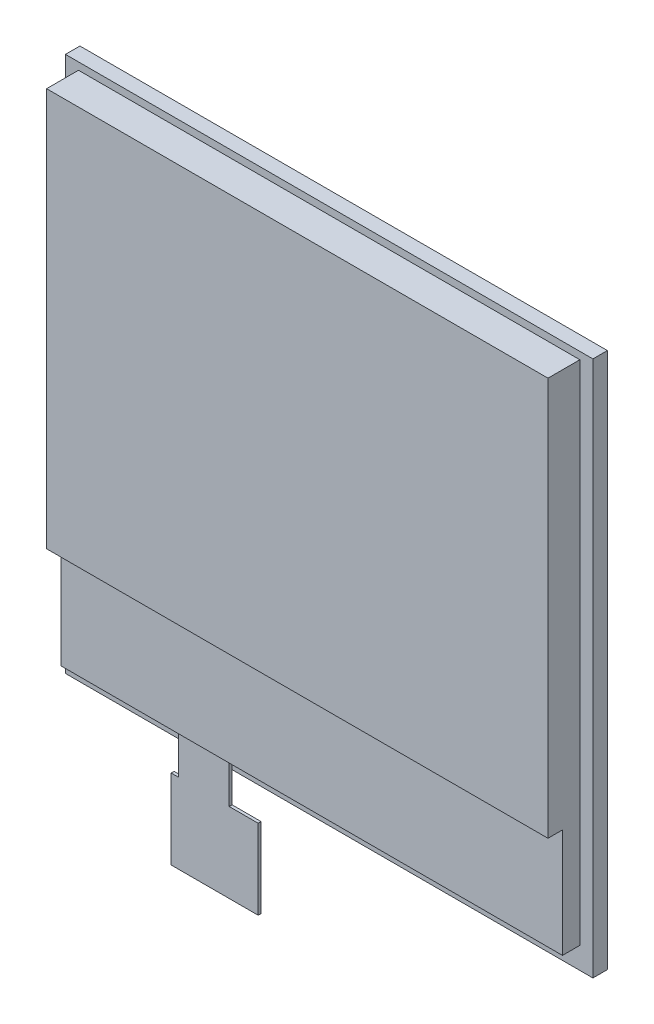
ISO-10303-21;
HEADER;
FILE_DESCRIPTION(('STEP AP214'),'2;1');
FILE_NAME('part.step','',(''),(''),'','','');
FILE_SCHEMA(('AUTOMOTIVE_DESIGN { 1 0 10303 214 1 1 1 1 }'));
ENDSEC;
DATA;
#1=APPLICATION_CONTEXT('core data for automotive mechanical design processes');
#2=APPLICATION_PROTOCOL_DEFINITION('international standard','automotive_design',2000,#1);
#3=PRODUCT_CONTEXT('',#1,'mechanical');
#4=PRODUCT('Part','Part','',(#3));
#5=PRODUCT_RELATED_PRODUCT_CATEGORY('part','',(#4));
#6=PRODUCT_DEFINITION_FORMATION('','',#4);
#7=PRODUCT_DEFINITION_CONTEXT('part definition',#1,'design');
#8=PRODUCT_DEFINITION('design','',#6,#7);
#9=PRODUCT_DEFINITION_SHAPE('','',#8);
#10=(LENGTH_UNIT() NAMED_UNIT(*) SI_UNIT(.MILLI.,.METRE.));
#11=(NAMED_UNIT(*) PLANE_ANGLE_UNIT() SI_UNIT($,.RADIAN.));
#12=(NAMED_UNIT(*) SI_UNIT($,.STERADIAN.) SOLID_ANGLE_UNIT());
#13=UNCERTAINTY_MEASURE_WITH_UNIT(LENGTH_MEASURE(1.E-05),#10,'distance_accuracy_value','');
#14=(GEOMETRIC_REPRESENTATION_CONTEXT(3) GLOBAL_UNCERTAINTY_ASSIGNED_CONTEXT((#13)) GLOBAL_UNIT_ASSIGNED_CONTEXT((#10,
#11,#12)) REPRESENTATION_CONTEXT('',''));
#15=CARTESIAN_POINT('',(0.,0.,0.));
#16=DIRECTION('',(0.,0.,1.));
#17=DIRECTION('',(1.,0.,0.));
#18=AXIS2_PLACEMENT_3D('',#15,#16,#17);
#19=CARTESIAN_POINT('',(0.,0.,1.));
#20=DIRECTION('',(0.,0.,-1.));
#21=DIRECTION('',(-1.,0.,0.));
#22=AXIS2_PLACEMENT_3D('',#19,#20,#21);
#23=PLANE('',#22);
#24=DIRECTION('',(-1.,0.,0.));
#25=VECTOR('',#24,1.);
#26=CARTESIAN_POINT('',(-18.2,-18.5,1.));
#27=LINE('',#26,#25);
#28=CARTESIAN_POINT('',(-6.70000000000001,-18.5,1.));
#29=VERTEX_POINT('',#28);
#30=CARTESIAN_POINT('',(-10.2,-18.5,1.));
#31=VERTEX_POINT('',#30);
#32=EDGE_CURVE('E340',#29,#31,#27,.T.);
#33=ORIENTED_EDGE('',*,*,#32,.F.);
#34=DIRECTION('',(0.,1.,0.));
#35=VECTOR('',#34,1.);
#36=CARTESIAN_POINT('',(-6.70000000000001,-17.,1.));
#37=LINE('',#36,#35);
#38=CARTESIAN_POINT('',(-6.70000000000001,-20.6,1.));
#39=VERTEX_POINT('',#38);
#40=EDGE_CURVE('E285',#39,#29,#37,.T.);
#41=ORIENTED_EDGE('',*,*,#40,.F.);
#42=DIRECTION('',(-1.,0.,0.));
#43=VECTOR('',#42,1.);
#44=CARTESIAN_POINT('',(-6.70000000000001,-20.6,1.));
#45=LINE('',#44,#43);
#46=CARTESIAN_POINT('',(-4.70000000000001,-20.6,1.));
#47=VERTEX_POINT('',#46);
#48=EDGE_CURVE('E313',#47,#39,#45,.T.);
#49=ORIENTED_EDGE('',*,*,#48,.F.);
#50=DIRECTION('',(0.,1.,0.));
#51=VECTOR('',#50,1.);
#52=CARTESIAN_POINT('',(-4.70000000000001,-20.6,1.));
#53=LINE('',#52,#51);
#54=CARTESIAN_POINT('',(-4.70000000000001,-26.1,1.));
#55=VERTEX_POINT('',#54);
#56=EDGE_CURVE('E311',#55,#47,#53,.T.);
#57=ORIENTED_EDGE('',*,*,#56,.F.);
#58=DIRECTION('',(1.,0.,0.));
#59=VECTOR('',#58,1.);
#60=CARTESIAN_POINT('',(-4.70000000000001,-26.1,1.));
#61=LINE('',#60,#59);
#62=CARTESIAN_POINT('',(-10.7,-26.1,1.));
#63=VERTEX_POINT('',#62);
#64=EDGE_CURVE('E309',#63,#55,#61,.T.);
#65=ORIENTED_EDGE('',*,*,#64,.F.);
#66=DIRECTION('',(0.,-1.,0.));
#67=VECTOR('',#66,1.);
#68=CARTESIAN_POINT('',(-10.7,-26.1,1.));
#69=LINE('',#68,#67);
#70=CARTESIAN_POINT('',(-10.7,-20.6,1.));
#71=VERTEX_POINT('',#70);
#72=EDGE_CURVE('E307',#71,#63,#69,.T.);
#73=ORIENTED_EDGE('',*,*,#72,.F.);
#74=DIRECTION('',(-1.,0.,0.));
#75=VECTOR('',#74,1.);
#76=CARTESIAN_POINT('',(-10.7,-20.6,1.));
#77=LINE('',#76,#75);
#78=CARTESIAN_POINT('',(-10.2,-20.6,1.));
#79=VERTEX_POINT('',#78);
#80=EDGE_CURVE('E305',#79,#71,#77,.T.);
#81=ORIENTED_EDGE('',*,*,#80,.F.);
#82=DIRECTION('',(0.,-1.,0.));
#83=VECTOR('',#82,1.);
#84=CARTESIAN_POINT('',(-10.2,-20.6,1.));
#85=LINE('',#84,#83);
#86=EDGE_CURVE('E280',#31,#79,#85,.T.);
#87=ORIENTED_EDGE('',*,*,#86,.F.);
#88=EDGE_LOOP('',(#33,#41,#49,#57,#65,#73,#81,#87));
#89=FACE_BOUND('',#88,.T.);
#90=DIRECTION('',(-1.,0.,0.));
#91=VECTOR('',#90,1.);
#92=CARTESIAN_POINT('',(-6.20000000000001,-25.1,1.));
#93=LINE('',#92,#91);
#94=CARTESIAN_POINT('',(-6.20000000000001,-25.1,1.));
#95=VERTEX_POINT('',#94);
#96=CARTESIAN_POINT('',(-9.20000000000001,-25.1,1.));
#97=VERTEX_POINT('',#96);
#98=EDGE_CURVE('E267',#95,#97,#93,.T.);
#99=ORIENTED_EDGE('',*,*,#98,.F.);
#100=DIRECTION('',(0.,-1.,0.));
#101=VECTOR('',#100,1.);
#102=CARTESIAN_POINT('',(-6.20000000000001,-21.6,1.));
#103=LINE('',#102,#101);
#104=CARTESIAN_POINT('',(-6.20000000000001,-21.6,1.));
#105=VERTEX_POINT('',#104);
#106=EDGE_CURVE('E232',#105,#95,#103,.T.);
#107=ORIENTED_EDGE('',*,*,#106,.F.);
#108=DIRECTION('',(1.,0.,0.));
#109=VECTOR('',#108,1.);
#110=CARTESIAN_POINT('',(-6.20000000000001,-21.6,1.));
#111=LINE('',#110,#109);
#112=CARTESIAN_POINT('',(-9.20000000000001,-21.6,1.));
#113=VERTEX_POINT('',#112);
#114=EDGE_CURVE('E258',#113,#105,#111,.T.);
#115=ORIENTED_EDGE('',*,*,#114,.F.);
#116=DIRECTION('',(0.,1.,0.));
#117=VECTOR('',#116,1.);
#118=CARTESIAN_POINT('',(-9.20000000000001,-21.6,1.));
#119=LINE('',#118,#117);
#120=EDGE_CURVE('E269',#97,#113,#119,.T.);
#121=ORIENTED_EDGE('',*,*,#120,.F.);
#122=EDGE_LOOP('',(#99,#107,#115,#121));
#123=FACE_BOUND('',#122,.T.);
#124=ADVANCED_FACE('F34',(#89,#123),#23,.T.);
#125=CARTESIAN_POINT('',(0.,0.,1.));
#126=DIRECTION('',(0.,0.,1.));
#127=DIRECTION('',(1.,0.,0.));
#128=AXIS2_PLACEMENT_3D('',#125,#126,#127);
#129=PLANE('',#128);
#130=DIRECTION('',(1.,0.,0.));
#131=VECTOR('',#130,1.);
#132=CARTESIAN_POINT('',(-18.2,-18.5,1.));
#133=LINE('',#132,#131);
#134=CARTESIAN_POINT('',(-18.2,-18.5,1.));
#135=VERTEX_POINT('',#134);
#136=EDGE_CURVE('E400',#135,#31,#133,.T.);
#137=ORIENTED_EDGE('',*,*,#136,.T.);
#138=CARTESIAN_POINT('',(-10.2,-17.,1.));
#139=VERTEX_POINT('',#138);
#140=EDGE_CURVE('E302',#139,#31,#85,.T.);
#141=ORIENTED_EDGE('',*,*,#140,.F.);
#142=DIRECTION('',(1.,0.,0.));
#143=VECTOR('',#142,1.);
#144=CARTESIAN_POINT('',(-17.3,-17.,1.));
#145=LINE('',#144,#143);
#146=CARTESIAN_POINT('',(-17.3,-17.,1.));
#147=VERTEX_POINT('',#146);
#148=EDGE_CURVE('E347',#147,#139,#145,.T.);
#149=ORIENTED_EDGE('',*,*,#148,.F.);
#150=DIRECTION('',(0.,-1.,0.));
#151=VECTOR('',#150,1.);
#152=CARTESIAN_POINT('',(-17.3,18.,1.));
#153=LINE('',#152,#151);
#154=CARTESIAN_POINT('',(-17.3,18.,1.));
#155=VERTEX_POINT('',#154);
#156=EDGE_CURVE('E366',#155,#147,#153,.T.);
#157=ORIENTED_EDGE('',*,*,#156,.F.);
#158=DIRECTION('',(-1.,0.,0.));
#159=VECTOR('',#158,1.);
#160=CARTESIAN_POINT('',(-17.3,18.,1.));
#161=LINE('',#160,#159);
#162=CARTESIAN_POINT('',(17.3,18.,1.));
#163=VERTEX_POINT('',#162);
#164=EDGE_CURVE('E375',#163,#155,#161,.T.);
#165=ORIENTED_EDGE('',*,*,#164,.F.);
#166=DIRECTION('',(0.,1.,0.));
#167=VECTOR('',#166,1.);
#168=CARTESIAN_POINT('',(17.3,18.,1.));
#169=LINE('',#168,#167);
#170=CARTESIAN_POINT('',(17.3,-17.,1.));
#171=VERTEX_POINT('',#170);
#172=EDGE_CURVE('E361',#171,#163,#169,.T.);
#173=ORIENTED_EDGE('',*,*,#172,.F.);
#174=CARTESIAN_POINT('',(-6.70000000000001,-17.,1.));
#175=VERTEX_POINT('',#174);
#176=EDGE_CURVE('E342',#175,#171,#145,.T.);
#177=ORIENTED_EDGE('',*,*,#176,.F.);
#178=EDGE_CURVE('E315',#29,#175,#37,.T.);
#179=ORIENTED_EDGE('',*,*,#178,.F.);
#180=CARTESIAN_POINT('',(18.2,-18.5,1.));
#181=VERTEX_POINT('',#180);
#182=EDGE_CURVE('E399',#29,#181,#133,.T.);
#183=ORIENTED_EDGE('',*,*,#182,.T.);
#184=DIRECTION('',(0.,1.,0.));
#185=VECTOR('',#184,1.);
#186=CARTESIAN_POINT('',(18.2,18.5,1.));
#187=LINE('',#186,#185);
#188=CARTESIAN_POINT('',(18.2,18.5,1.));
#189=VERTEX_POINT('',#188);
#190=EDGE_CURVE('E391',#181,#189,#187,.T.);
#191=ORIENTED_EDGE('',*,*,#190,.T.);
#192=DIRECTION('',(-1.,0.,0.));
#193=VECTOR('',#192,1.);
#194=CARTESIAN_POINT('',(-18.2,18.5,1.));
#195=LINE('',#194,#193);
#196=CARTESIAN_POINT('',(-18.2,18.5,1.));
#197=VERTEX_POINT('',#196);
#198=EDGE_CURVE('E394',#189,#197,#195,.T.);
#199=ORIENTED_EDGE('',*,*,#198,.T.);
#200=DIRECTION('',(0.,-1.,0.));
#201=VECTOR('',#200,1.);
#202=CARTESIAN_POINT('',(-18.2,18.5,1.));
#203=LINE('',#202,#201);
#204=EDGE_CURVE('E397',#197,#135,#203,.T.);
#205=ORIENTED_EDGE('',*,*,#204,.T.);
#206=EDGE_LOOP('',(#137,#141,#149,#157,#165,#173,#177,#179,#183,#191,#199,#205));
#207=FACE_BOUND('',#206,.T.);
#208=ADVANCED_FACE('F436',(#207),#129,.T.);
#209=CARTESIAN_POINT('',(-17.3,-17.,2.2));
#210=DIRECTION('',(0.,1.,0.));
#211=DIRECTION('',(0.,0.,1.));
#212=AXIS2_PLACEMENT_3D('',#209,#210,#211);
#213=PLANE('',#212);
#214=DIRECTION('',(0.,0.,-1.));
#215=VECTOR('',#214,1.);
#216=CARTESIAN_POINT('',(-10.2,-17.,1.2));
#217=LINE('',#216,#215);
#218=CARTESIAN_POINT('',(-10.2,-17.,1.2));
#219=VERTEX_POINT('',#218);
#220=EDGE_CURVE('E301',#219,#139,#217,.T.);
#221=ORIENTED_EDGE('',*,*,#220,.F.);
#222=DIRECTION('',(-1.,0.,0.));
#223=VECTOR('',#222,1.);
#224=CARTESIAN_POINT('',(-10.2,-17.,1.2));
#225=LINE('',#224,#223);
#226=CARTESIAN_POINT('',(-6.70000000000001,-17.,1.2));
#227=VERTEX_POINT('',#226);
#228=EDGE_CURVE('E298',#227,#219,#225,.T.);
#229=ORIENTED_EDGE('',*,*,#228,.F.);
#230=DIRECTION('',(0.,0.,-1.));
#231=VECTOR('',#230,1.);
#232=CARTESIAN_POINT('',(-6.70000000000001,-17.,1.2));
#233=LINE('',#232,#231);
#234=EDGE_CURVE('E320',#227,#175,#233,.T.);
#235=ORIENTED_EDGE('',*,*,#234,.T.);
#236=ORIENTED_EDGE('',*,*,#176,.T.);
#237=DIRECTION('',(0.,0.,-1.));
#238=VECTOR('',#237,1.);
#239=CARTESIAN_POINT('',(17.3,-17.,2.2));
#240=LINE('',#239,#238);
#241=CARTESIAN_POINT('',(17.3,-17.,2.2));
#242=VERTEX_POINT('',#241);
#243=EDGE_CURVE('E353',#242,#171,#240,.T.);
#244=ORIENTED_EDGE('',*,*,#243,.F.);
#245=DIRECTION('',(1.,0.,0.));
#246=VECTOR('',#245,1.);
#247=CARTESIAN_POINT('',(-17.3,-17.,2.2));
#248=LINE('',#247,#246);
#249=CARTESIAN_POINT('',(-17.3,-17.,2.2));
#250=VERTEX_POINT('',#249);
#251=EDGE_CURVE('E346',#250,#242,#248,.T.);
#252=ORIENTED_EDGE('',*,*,#251,.F.);
#253=DIRECTION('',(0.,0.,-1.));
#254=VECTOR('',#253,1.);
#255=CARTESIAN_POINT('',(-17.3,-17.,2.2));
#256=LINE('',#255,#254);
#257=EDGE_CURVE('E358',#250,#147,#256,.T.);
#258=ORIENTED_EDGE('',*,*,#257,.T.);
#259=ORIENTED_EDGE('',*,*,#148,.T.);
#260=EDGE_LOOP('',(#221,#229,#235,#236,#244,#252,#258,#259));
#261=FACE_BOUND('',#260,.T.);
#262=ADVANCED_FACE('F478',(#261),#213,.F.);
#263=CARTESIAN_POINT('',(18.2,18.5,1.));
#264=DIRECTION('',(-1.,0.,0.));
#265=DIRECTION('',(0.,-1.,0.));
#266=AXIS2_PLACEMENT_3D('',#263,#264,#265);
#267=PLANE('',#266);
#268=DIRECTION('',(0.,1.,0.));
#269=VECTOR('',#268,1.);
#270=CARTESIAN_POINT('',(18.2,18.5,0.));
#271=LINE('',#270,#269);
#272=CARTESIAN_POINT('',(18.2,-18.5,0.));
#273=VERTEX_POINT('',#272);
#274=CARTESIAN_POINT('',(18.2,18.5,0.));
#275=VERTEX_POINT('',#274);
#276=EDGE_CURVE('E390',#273,#275,#271,.T.);
#277=ORIENTED_EDGE('',*,*,#276,.T.);
#278=DIRECTION('',(0.,0.,-1.));
#279=VECTOR('',#278,1.);
#280=CARTESIAN_POINT('',(18.2,18.5,1.));
#281=LINE('',#280,#279);
#282=EDGE_CURVE('E11',#189,#275,#281,.T.);
#283=ORIENTED_EDGE('',*,*,#282,.F.);
#284=ORIENTED_EDGE('',*,*,#190,.F.);
#285=DIRECTION('',(0.,0.,-1.));
#286=VECTOR('',#285,1.);
#287=CARTESIAN_POINT('',(18.2,-18.5,1.));
#288=LINE('',#287,#286);
#289=EDGE_CURVE('E403',#181,#273,#288,.T.);
#290=ORIENTED_EDGE('',*,*,#289,.T.);
#291=EDGE_LOOP('',(#277,#283,#284,#290));
#292=FACE_BOUND('',#291,.T.);
#293=ADVANCED_FACE('F36',(#292),#267,.F.);
#294=CARTESIAN_POINT('',(-18.2,18.5,1.));
#295=DIRECTION('',(0.,-1.,0.));
#296=DIRECTION('',(0.,0.,-1.));
#297=AXIS2_PLACEMENT_3D('',#294,#295,#296);
#298=PLANE('',#297);
#299=DIRECTION('',(-1.,0.,0.));
#300=VECTOR('',#299,1.);
#301=CARTESIAN_POINT('',(-18.2,18.5,0.));
#302=LINE('',#301,#300);
#303=CARTESIAN_POINT('',(-18.2,18.5,0.));
#304=VERTEX_POINT('',#303);
#305=EDGE_CURVE('E406',#275,#304,#302,.T.);
#306=ORIENTED_EDGE('',*,*,#305,.T.);
#307=DIRECTION('',(0.,0.,-1.));
#308=VECTOR('',#307,1.);
#309=CARTESIAN_POINT('',(-18.2,18.5,1.));
#310=LINE('',#309,#308);
#311=EDGE_CURVE('E42',#197,#304,#310,.T.);
#312=ORIENTED_EDGE('',*,*,#311,.F.);
#313=ORIENTED_EDGE('',*,*,#198,.F.);
#314=ORIENTED_EDGE('',*,*,#282,.T.);
#315=EDGE_LOOP('',(#306,#312,#313,#314));
#316=FACE_BOUND('',#315,.T.);
#317=ADVANCED_FACE('F739',(#316),#298,.F.);
#318=CARTESIAN_POINT('',(-18.2,18.5,1.));
#319=DIRECTION('',(1.,0.,0.));
#320=DIRECTION('',(0.,0.,-1.));
#321=AXIS2_PLACEMENT_3D('',#318,#319,#320);
#322=PLANE('',#321);
#323=DIRECTION('',(0.,-1.,0.));
#324=VECTOR('',#323,1.);
#325=CARTESIAN_POINT('',(-18.2,18.5,0.));
#326=LINE('',#325,#324);
#327=CARTESIAN_POINT('',(-18.2,-18.5,0.));
#328=VERTEX_POINT('',#327);
#329=EDGE_CURVE('E408',#304,#328,#326,.T.);
#330=ORIENTED_EDGE('',*,*,#329,.T.);
#331=DIRECTION('',(0.,0.,-1.));
#332=VECTOR('',#331,1.);
#333=CARTESIAN_POINT('',(-18.2,-18.5,1.));
#334=LINE('',#333,#332);
#335=EDGE_CURVE('E413',#135,#328,#334,.T.);
#336=ORIENTED_EDGE('',*,*,#335,.F.);
#337=ORIENTED_EDGE('',*,*,#204,.F.);
#338=ORIENTED_EDGE('',*,*,#311,.T.);
#339=EDGE_LOOP('',(#330,#336,#337,#338));
#340=FACE_BOUND('',#339,.T.);
#341=ADVANCED_FACE('F420',(#340),#322,.F.);
#342=CARTESIAN_POINT('',(-18.2,-18.5,1.));
#343=DIRECTION('',(0.,1.,0.));
#344=DIRECTION('',(0.,0.,1.));
#345=AXIS2_PLACEMENT_3D('',#342,#343,#344);
#346=PLANE('',#345);
#347=DIRECTION('',(1.,0.,0.));
#348=VECTOR('',#347,1.);
#349=CARTESIAN_POINT('',(-18.2,-18.5,0.));
#350=LINE('',#349,#348);
#351=EDGE_CURVE('E395',#328,#273,#350,.T.);
#352=ORIENTED_EDGE('',*,*,#351,.T.);
#353=ORIENTED_EDGE('',*,*,#289,.F.);
#354=ORIENTED_EDGE('',*,*,#182,.F.);
#355=ORIENTED_EDGE('',*,*,#32,.T.);
#356=ORIENTED_EDGE('',*,*,#136,.F.);
#357=ORIENTED_EDGE('',*,*,#335,.T.);
#358=EDGE_LOOP('',(#352,#353,#354,#355,#356,#357));
#359=FACE_BOUND('',#358,.T.);
#360=ADVANCED_FACE('F429',(#359),#346,.F.);
#361=CARTESIAN_POINT('',(0.,0.,0.));
#362=DIRECTION('',(0.,0.,1.));
#363=DIRECTION('',(1.,0.,0.));
#364=AXIS2_PLACEMENT_3D('',#361,#362,#363);
#365=PLANE('',#364);
#366=ORIENTED_EDGE('',*,*,#276,.F.);
#367=ORIENTED_EDGE('',*,*,#351,.F.);
#368=ORIENTED_EDGE('',*,*,#329,.F.);
#369=ORIENTED_EDGE('',*,*,#305,.F.);
#370=EDGE_LOOP('',(#366,#367,#368,#369));
#371=FACE_BOUND('',#370,.T.);
#372=ADVANCED_FACE('F426',(#371),#365,.F.);
#373=CARTESIAN_POINT('',(17.3,18.,3.2));
#374=DIRECTION('',(-1.,0.,0.));
#375=DIRECTION('',(0.,-1.,0.));
#376=AXIS2_PLACEMENT_3D('',#373,#374,#375);
#377=PLANE('',#376);
#378=ORIENTED_EDGE('',*,*,#172,.T.);
#379=DIRECTION('',(0.,0.,-1.));
#380=VECTOR('',#379,1.);
#381=CARTESIAN_POINT('',(17.3,18.,3.2));
#382=LINE('',#381,#380);
#383=CARTESIAN_POINT('',(17.3,18.,3.2));
#384=VERTEX_POINT('',#383);
#385=EDGE_CURVE('E387',#384,#163,#382,.T.);
#386=ORIENTED_EDGE('',*,*,#385,.F.);
#387=DIRECTION('',(0.,1.,0.));
#388=VECTOR('',#387,1.);
#389=CARTESIAN_POINT('',(17.3,18.,3.2));
#390=LINE('',#389,#388);
#391=CARTESIAN_POINT('',(17.3,-9.50000000000001,3.2));
#392=VERTEX_POINT('',#391);
#393=EDGE_CURVE('E362',#392,#384,#390,.T.);
#394=ORIENTED_EDGE('',*,*,#393,.F.);
#395=DIRECTION('',(0.,0.,-1.));
#396=VECTOR('',#395,1.);
#397=CARTESIAN_POINT('',(17.3,-9.50000000000001,3.2));
#398=LINE('',#397,#396);
#399=CARTESIAN_POINT('',(17.3,-9.50000000000001,2.2));
#400=VERTEX_POINT('',#399);
#401=EDGE_CURVE('E372',#392,#400,#398,.T.);
#402=ORIENTED_EDGE('',*,*,#401,.T.);
#403=DIRECTION('',(0.,1.,0.));
#404=VECTOR('',#403,1.);
#405=CARTESIAN_POINT('',(17.3,-9.50000000000001,2.2));
#406=LINE('',#405,#404);
#407=EDGE_CURVE('E349',#242,#400,#406,.T.);
#408=ORIENTED_EDGE('',*,*,#407,.F.);
#409=ORIENTED_EDGE('',*,*,#243,.T.);
#410=EDGE_LOOP('',(#378,#386,#394,#402,#408,#409));
#411=FACE_BOUND('',#410,.T.);
#412=ADVANCED_FACE('F493',(#411),#377,.F.);
#413=CARTESIAN_POINT('',(-17.3,18.,3.2));
#414=DIRECTION('',(0.,-1.,0.));
#415=DIRECTION('',(0.,0.,-1.));
#416=AXIS2_PLACEMENT_3D('',#413,#414,#415);
#417=PLANE('',#416);
#418=ORIENTED_EDGE('',*,*,#164,.T.);
#419=DIRECTION('',(0.,0.,-1.));
#420=VECTOR('',#419,1.);
#421=CARTESIAN_POINT('',(-17.3,18.,3.2));
#422=LINE('',#421,#420);
#423=CARTESIAN_POINT('',(-17.3,18.,3.2));
#424=VERTEX_POINT('',#423);
#425=EDGE_CURVE('E384',#424,#155,#422,.T.);
#426=ORIENTED_EDGE('',*,*,#425,.F.);
#427=DIRECTION('',(-1.,0.,0.));
#428=VECTOR('',#427,1.);
#429=CARTESIAN_POINT('',(-17.3,18.,3.2));
#430=LINE('',#429,#428);
#431=EDGE_CURVE('E365',#384,#424,#430,.T.);
#432=ORIENTED_EDGE('',*,*,#431,.F.);
#433=ORIENTED_EDGE('',*,*,#385,.T.);
#434=EDGE_LOOP('',(#418,#426,#432,#433));
#435=FACE_BOUND('',#434,.T.);
#436=ADVANCED_FACE('F489',(#435),#417,.F.);
#437=CARTESIAN_POINT('',(-17.3,18.,3.2));
#438=DIRECTION('',(1.,0.,0.));
#439=DIRECTION('',(0.,1.,0.));
#440=AXIS2_PLACEMENT_3D('',#437,#438,#439);
#441=PLANE('',#440);
#442=ORIENTED_EDGE('',*,*,#156,.T.);
#443=ORIENTED_EDGE('',*,*,#257,.F.);
#444=DIRECTION('',(0.,-1.,0.));
#445=VECTOR('',#444,1.);
#446=CARTESIAN_POINT('',(-17.3,-9.50000000000001,2.2));
#447=LINE('',#446,#445);
#448=CARTESIAN_POINT('',(-17.3,-9.50000000000001,2.2));
#449=VERTEX_POINT('',#448);
#450=EDGE_CURVE('E343',#449,#250,#447,.T.);
#451=ORIENTED_EDGE('',*,*,#450,.F.);
#452=DIRECTION('',(0.,0.,-1.));
#453=VECTOR('',#452,1.);
#454=CARTESIAN_POINT('',(-17.3,-9.50000000000001,3.2));
#455=LINE('',#454,#453);
#456=CARTESIAN_POINT('',(-17.3,-9.50000000000001,3.2));
#457=VERTEX_POINT('',#456);
#458=EDGE_CURVE('E381',#457,#449,#455,.T.);
#459=ORIENTED_EDGE('',*,*,#458,.F.);
#460=DIRECTION('',(0.,-1.,0.));
#461=VECTOR('',#460,1.);
#462=CARTESIAN_POINT('',(-17.3,18.,3.2));
#463=LINE('',#462,#461);
#464=EDGE_CURVE('E368',#424,#457,#463,.T.);
#465=ORIENTED_EDGE('',*,*,#464,.F.);
#466=ORIENTED_EDGE('',*,*,#425,.T.);
#467=EDGE_LOOP('',(#442,#443,#451,#459,#465,#466));
#468=FACE_BOUND('',#467,.T.);
#469=ADVANCED_FACE('F483',(#468),#441,.F.);
#470=CARTESIAN_POINT('',(-17.3,-9.50000000000001,3.2));
#471=DIRECTION('',(0.,1.,0.));
#472=DIRECTION('',(0.,0.,1.));
#473=AXIS2_PLACEMENT_3D('',#470,#471,#472);
#474=PLANE('',#473);
#475=ORIENTED_EDGE('',*,*,#458,.T.);
#476=DIRECTION('',(-1.,0.,0.));
#477=VECTOR('',#476,1.);
#478=CARTESIAN_POINT('',(-17.3,-9.50000000000001,2.2));
#479=LINE('',#478,#477);
#480=EDGE_CURVE('E351',#400,#449,#479,.T.);
#481=ORIENTED_EDGE('',*,*,#480,.F.);
#482=ORIENTED_EDGE('',*,*,#401,.F.);
#483=DIRECTION('',(1.,0.,0.));
#484=VECTOR('',#483,1.);
#485=CARTESIAN_POINT('',(-17.3,-9.50000000000001,3.2));
#486=LINE('',#485,#484);
#487=EDGE_CURVE('E370',#457,#392,#486,.T.);
#488=ORIENTED_EDGE('',*,*,#487,.F.);
#489=EDGE_LOOP('',(#475,#481,#482,#488));
#490=FACE_BOUND('',#489,.T.);
#491=ADVANCED_FACE('F695',(#490),#474,.F.);
#492=CARTESIAN_POINT('',(0.,0.,3.2));
#493=DIRECTION('',(0.,0.,1.));
#494=DIRECTION('',(1.,0.,0.));
#495=AXIS2_PLACEMENT_3D('',#492,#493,#494);
#496=PLANE('',#495);
#497=ORIENTED_EDGE('',*,*,#393,.T.);
#498=ORIENTED_EDGE('',*,*,#431,.T.);
#499=ORIENTED_EDGE('',*,*,#464,.T.);
#500=ORIENTED_EDGE('',*,*,#487,.T.);
#501=EDGE_LOOP('',(#497,#498,#499,#500));
#502=FACE_BOUND('',#501,.T.);
#503=ADVANCED_FACE('F686',(#502),#496,.T.);
#504=CARTESIAN_POINT('',(0.,0.,2.2));
#505=DIRECTION('',(0.,0.,1.));
#506=DIRECTION('',(1.,0.,0.));
#507=AXIS2_PLACEMENT_3D('',#504,#505,#506);
#508=PLANE('',#507);
#509=ORIENTED_EDGE('',*,*,#450,.T.);
#510=ORIENTED_EDGE('',*,*,#251,.T.);
#511=ORIENTED_EDGE('',*,*,#407,.T.);
#512=ORIENTED_EDGE('',*,*,#480,.T.);
#513=EDGE_LOOP('',(#509,#510,#511,#512));
#514=FACE_BOUND('',#513,.T.);
#515=ADVANCED_FACE('F608',(#514),#508,.T.);
#516=CARTESIAN_POINT('',(-10.2,-20.6,1.2));
#517=DIRECTION('',(1.,0.,0.));
#518=DIRECTION('',(0.,0.,-1.));
#519=AXIS2_PLACEMENT_3D('',#516,#517,#518);
#520=PLANE('',#519);
#521=ORIENTED_EDGE('',*,*,#140,.T.);
#522=ORIENTED_EDGE('',*,*,#86,.T.);
#523=DIRECTION('',(0.,0.,-1.));
#524=VECTOR('',#523,1.);
#525=CARTESIAN_POINT('',(-10.2,-20.6,1.2));
#526=LINE('',#525,#524);
#527=CARTESIAN_POINT('',(-10.2,-20.6,1.2));
#528=VERTEX_POINT('',#527);
#529=EDGE_CURVE('E337',#528,#79,#526,.T.);
#530=ORIENTED_EDGE('',*,*,#529,.F.);
#531=DIRECTION('',(0.,-1.,0.));
#532=VECTOR('',#531,1.);
#533=CARTESIAN_POINT('',(-10.2,-20.6,1.2));
#534=LINE('',#533,#532);
#535=EDGE_CURVE('E281',#219,#528,#534,.T.);
#536=ORIENTED_EDGE('',*,*,#535,.F.);
#537=ORIENTED_EDGE('',*,*,#220,.T.);
#538=EDGE_LOOP('',(#521,#522,#530,#536,#537));
#539=FACE_BOUND('',#538,.T.);
#540=ADVANCED_FACE('F475',(#539),#520,.F.);
#541=CARTESIAN_POINT('',(-10.7,-20.6,1.2));
#542=DIRECTION('',(0.,-1.,0.));
#543=DIRECTION('',(0.,0.,-1.));
#544=AXIS2_PLACEMENT_3D('',#541,#542,#543);
#545=PLANE('',#544);
#546=ORIENTED_EDGE('',*,*,#80,.T.);
#547=DIRECTION('',(0.,0.,-1.));
#548=VECTOR('',#547,1.);
#549=CARTESIAN_POINT('',(-10.7,-20.6,1.2));
#550=LINE('',#549,#548);
#551=CARTESIAN_POINT('',(-10.7,-20.6,1.2));
#552=VERTEX_POINT('',#551);
#553=EDGE_CURVE('E334',#552,#71,#550,.T.);
#554=ORIENTED_EDGE('',*,*,#553,.F.);
#555=DIRECTION('',(-1.,0.,0.));
#556=VECTOR('',#555,1.);
#557=CARTESIAN_POINT('',(-10.7,-20.6,1.2));
#558=LINE('',#557,#556);
#559=EDGE_CURVE('E284',#528,#552,#558,.T.);
#560=ORIENTED_EDGE('',*,*,#559,.F.);
#561=ORIENTED_EDGE('',*,*,#529,.T.);
#562=EDGE_LOOP('',(#546,#554,#560,#561));
#563=FACE_BOUND('',#562,.T.);
#564=ADVANCED_FACE('F472',(#563),#545,.F.);
#565=CARTESIAN_POINT('',(-10.7,-26.1,1.2));
#566=DIRECTION('',(1.,0.,0.));
#567=DIRECTION('',(0.,0.,-1.));
#568=AXIS2_PLACEMENT_3D('',#565,#566,#567);
#569=PLANE('',#568);
#570=ORIENTED_EDGE('',*,*,#72,.T.);
#571=DIRECTION('',(0.,0.,-1.));
#572=VECTOR('',#571,1.);
#573=CARTESIAN_POINT('',(-10.7,-26.1,1.2));
#574=LINE('',#573,#572);
#575=CARTESIAN_POINT('',(-10.7,-26.1,1.2));
#576=VERTEX_POINT('',#575);
#577=EDGE_CURVE('E331',#576,#63,#574,.T.);
#578=ORIENTED_EDGE('',*,*,#577,.F.);
#579=DIRECTION('',(0.,-1.,0.));
#580=VECTOR('',#579,1.);
#581=CARTESIAN_POINT('',(-10.7,-26.1,1.2));
#582=LINE('',#581,#580);
#583=EDGE_CURVE('E287',#552,#576,#582,.T.);
#584=ORIENTED_EDGE('',*,*,#583,.F.);
#585=ORIENTED_EDGE('',*,*,#553,.T.);
#586=EDGE_LOOP('',(#570,#578,#584,#585));
#587=FACE_BOUND('',#586,.T.);
#588=ADVANCED_FACE('F468',(#587),#569,.F.);
#589=CARTESIAN_POINT('',(-4.70000000000001,-26.1,1.2));
#590=DIRECTION('',(0.,1.,0.));
#591=DIRECTION('',(0.,0.,1.));
#592=AXIS2_PLACEMENT_3D('',#589,#590,#591);
#593=PLANE('',#592);
#594=ORIENTED_EDGE('',*,*,#64,.T.);
#595=DIRECTION('',(0.,0.,-1.));
#596=VECTOR('',#595,1.);
#597=CARTESIAN_POINT('',(-4.70000000000001,-26.1,1.2));
#598=LINE('',#597,#596);
#599=CARTESIAN_POINT('',(-4.70000000000001,-26.1,1.2));
#600=VERTEX_POINT('',#599);
#601=EDGE_CURVE('E328',#600,#55,#598,.T.);
#602=ORIENTED_EDGE('',*,*,#601,.F.);
#603=DIRECTION('',(1.,0.,0.));
#604=VECTOR('',#603,1.);
#605=CARTESIAN_POINT('',(-4.70000000000001,-26.1,1.2));
#606=LINE('',#605,#604);
#607=EDGE_CURVE('E289',#576,#600,#606,.T.);
#608=ORIENTED_EDGE('',*,*,#607,.F.);
#609=ORIENTED_EDGE('',*,*,#577,.T.);
#610=EDGE_LOOP('',(#594,#602,#608,#609));
#611=FACE_BOUND('',#610,.T.);
#612=ADVANCED_FACE('F464',(#611),#593,.F.);
#613=CARTESIAN_POINT('',(-4.70000000000001,-20.6,1.2));
#614=DIRECTION('',(-1.,0.,0.));
#615=DIRECTION('',(0.,-1.,0.));
#616=AXIS2_PLACEMENT_3D('',#613,#614,#615);
#617=PLANE('',#616);
#618=ORIENTED_EDGE('',*,*,#56,.T.);
#619=DIRECTION('',(0.,0.,-1.));
#620=VECTOR('',#619,1.);
#621=CARTESIAN_POINT('',(-4.70000000000001,-20.6,1.2));
#622=LINE('',#621,#620);
#623=CARTESIAN_POINT('',(-4.70000000000001,-20.6,1.2));
#624=VERTEX_POINT('',#623);
#625=EDGE_CURVE('E325',#624,#47,#622,.T.);
#626=ORIENTED_EDGE('',*,*,#625,.F.);
#627=DIRECTION('',(0.,1.,0.));
#628=VECTOR('',#627,1.);
#629=CARTESIAN_POINT('',(-4.70000000000001,-20.6,1.2));
#630=LINE('',#629,#628);
#631=EDGE_CURVE('E291',#600,#624,#630,.T.);
#632=ORIENTED_EDGE('',*,*,#631,.F.);
#633=ORIENTED_EDGE('',*,*,#601,.T.);
#634=EDGE_LOOP('',(#618,#626,#632,#633));
#635=FACE_BOUND('',#634,.T.);
#636=ADVANCED_FACE('F459',(#635),#617,.F.);
#637=CARTESIAN_POINT('',(-6.70000000000001,-20.6,1.2));
#638=DIRECTION('',(0.,-1.,0.));
#639=DIRECTION('',(1.,0.,0.));
#640=AXIS2_PLACEMENT_3D('',#637,#638,#639);
#641=PLANE('',#640);
#642=ORIENTED_EDGE('',*,*,#48,.T.);
#643=DIRECTION('',(0.,0.,-1.));
#644=VECTOR('',#643,1.);
#645=CARTESIAN_POINT('',(-6.70000000000001,-20.6,1.2));
#646=LINE('',#645,#644);
#647=CARTESIAN_POINT('',(-6.70000000000001,-20.6,1.2));
#648=VERTEX_POINT('',#647);
#649=EDGE_CURVE('E322',#648,#39,#646,.T.);
#650=ORIENTED_EDGE('',*,*,#649,.F.);
#651=DIRECTION('',(-1.,0.,0.));
#652=VECTOR('',#651,1.);
#653=CARTESIAN_POINT('',(-6.70000000000001,-20.6,1.2));
#654=LINE('',#653,#652);
#655=EDGE_CURVE('E293',#624,#648,#654,.T.);
#656=ORIENTED_EDGE('',*,*,#655,.F.);
#657=ORIENTED_EDGE('',*,*,#625,.T.);
#658=EDGE_LOOP('',(#642,#650,#656,#657));
#659=FACE_BOUND('',#658,.T.);
#660=ADVANCED_FACE('F453',(#659),#641,.F.);
#661=CARTESIAN_POINT('',(-6.70000000000001,-17.,1.2));
#662=DIRECTION('',(-1.,0.,0.));
#663=DIRECTION('',(0.,-1.,0.));
#664=AXIS2_PLACEMENT_3D('',#661,#662,#663);
#665=PLANE('',#664);
#666=ORIENTED_EDGE('',*,*,#40,.T.);
#667=ORIENTED_EDGE('',*,*,#178,.T.);
#668=ORIENTED_EDGE('',*,*,#234,.F.);
#669=DIRECTION('',(0.,1.,0.));
#670=VECTOR('',#669,1.);
#671=CARTESIAN_POINT('',(-6.70000000000001,-17.,1.2));
#672=LINE('',#671,#670);
#673=EDGE_CURVE('E295',#648,#227,#672,.T.);
#674=ORIENTED_EDGE('',*,*,#673,.F.);
#675=ORIENTED_EDGE('',*,*,#649,.T.);
#676=EDGE_LOOP('',(#666,#667,#668,#674,#675));
#677=FACE_BOUND('',#676,.T.);
#678=ADVANCED_FACE('F447',(#677),#665,.F.);
#679=CARTESIAN_POINT('',(0.,0.,1.2));
#680=DIRECTION('',(0.,0.,-1.));
#681=DIRECTION('',(-1.,0.,0.));
#682=AXIS2_PLACEMENT_3D('',#679,#680,#681);
#683=PLANE('',#682);
#684=ORIENTED_EDGE('',*,*,#535,.T.);
#685=ORIENTED_EDGE('',*,*,#559,.T.);
#686=ORIENTED_EDGE('',*,*,#583,.T.);
#687=ORIENTED_EDGE('',*,*,#607,.T.);
#688=ORIENTED_EDGE('',*,*,#631,.T.);
#689=ORIENTED_EDGE('',*,*,#655,.T.);
#690=ORIENTED_EDGE('',*,*,#673,.T.);
#691=ORIENTED_EDGE('',*,*,#228,.T.);
#692=EDGE_LOOP('',(#684,#685,#686,#687,#688,#689,#690,#691));
#693=FACE_BOUND('',#692,.T.);
#694=ADVANCED_FACE('F496',(#693),#683,.F.);
#695=CARTESIAN_POINT('',(0.,0.,0.1));
#696=DIRECTION('',(0.,0.,-1.));
#697=DIRECTION('',(-1.,0.,0.));
#698=AXIS2_PLACEMENT_3D('',#695,#696,#697);
#699=PLANE('',#698);
#700=DIRECTION('',(0.,-1.,0.));
#701=VECTOR('',#700,1.);
#702=CARTESIAN_POINT('',(-6.20000000000001,-21.6,0.1));
#703=LINE('',#702,#701);
#704=CARTESIAN_POINT('',(-6.20000000000001,-21.6,0.1));
#705=VERTEX_POINT('',#704);
#706=CARTESIAN_POINT('',(-6.20000000000001,-25.1,0.1));
#707=VERTEX_POINT('',#706);
#708=EDGE_CURVE('E254',#705,#707,#703,.T.);
#709=ORIENTED_EDGE('',*,*,#708,.T.);
#710=DIRECTION('',(-1.,0.,0.));
#711=VECTOR('',#710,1.);
#712=CARTESIAN_POINT('',(-6.20000000000001,-25.1,0.1));
#713=LINE('',#712,#711);
#714=CARTESIAN_POINT('',(-9.20000000000001,-25.1,0.1));
#715=VERTEX_POINT('',#714);
#716=EDGE_CURVE('E257',#707,#715,#713,.T.);
#717=ORIENTED_EDGE('',*,*,#716,.T.);
#718=DIRECTION('',(0.,1.,0.));
#719=VECTOR('',#718,1.);
#720=CARTESIAN_POINT('',(-9.20000000000001,-21.6,0.1));
#721=LINE('',#720,#719);
#722=CARTESIAN_POINT('',(-9.20000000000001,-21.6,0.1));
#723=VERTEX_POINT('',#722);
#724=EDGE_CURVE('E260',#715,#723,#721,.T.);
#725=ORIENTED_EDGE('',*,*,#724,.T.);
#726=DIRECTION('',(1.,0.,0.));
#727=VECTOR('',#726,1.);
#728=CARTESIAN_POINT('',(-6.20000000000001,-21.6,0.1));
#729=LINE('',#728,#727);
#730=EDGE_CURVE('E262',#723,#705,#729,.T.);
#731=ORIENTED_EDGE('',*,*,#730,.T.);
#732=EDGE_LOOP('',(#709,#717,#725,#731));
#733=FACE_BOUND('',#732,.T.);
#734=DIRECTION('',(-1.,0.,0.));
#735=VECTOR('',#734,1.);
#736=CARTESIAN_POINT('',(-6.90000000000001,-24.6,0.1));
#737=LINE('',#736,#735);
#738=CARTESIAN_POINT('',(-6.90000000000001,-24.6,0.1));
#739=VERTEX_POINT('',#738);
#740=CARTESIAN_POINT('',(-8.50000000000001,-24.6,0.1));
#741=VERTEX_POINT('',#740);
#742=EDGE_CURVE('E224',#739,#741,#737,.T.);
#743=ORIENTED_EDGE('',*,*,#742,.F.);
#744=DIRECTION('',(0.,-1.,0.));
#745=VECTOR('',#744,1.);
#746=CARTESIAN_POINT('',(-6.90000000000001,-22.1,0.1));
#747=LINE('',#746,#745);
#748=CARTESIAN_POINT('',(-6.90000000000001,-22.1,0.1));
#749=VERTEX_POINT('',#748);
#750=EDGE_CURVE('E215',#749,#739,#747,.T.);
#751=ORIENTED_EDGE('',*,*,#750,.F.);
#752=DIRECTION('',(1.,0.,0.));
#753=VECTOR('',#752,1.);
#754=CARTESIAN_POINT('',(-6.90000000000001,-22.1,0.1));
#755=LINE('',#754,#753);
#756=CARTESIAN_POINT('',(-8.50000000000001,-22.1,0.1));
#757=VERTEX_POINT('',#756);
#758=EDGE_CURVE('E240',#757,#749,#755,.T.);
#759=ORIENTED_EDGE('',*,*,#758,.F.);
#760=DIRECTION('',(0.,1.,0.));
#761=VECTOR('',#760,1.);
#762=CARTESIAN_POINT('',(-8.50000000000001,-22.1,0.1));
#763=LINE('',#762,#761);
#764=EDGE_CURVE('E238',#741,#757,#763,.T.);
#765=ORIENTED_EDGE('',*,*,#764,.F.);
#766=EDGE_LOOP('',(#743,#751,#759,#765));
#767=FACE_BOUND('',#766,.T.);
#768=ADVANCED_FACE('F236',(#733,#767),#699,.T.);
#769=CARTESIAN_POINT('',(-6.20000000000001,-21.6,0.1));
#770=DIRECTION('',(-1.,0.,0.));
#771=DIRECTION('',(0.,-1.,0.));
#772=AXIS2_PLACEMENT_3D('',#769,#770,#771);
#773=PLANE('',#772);
#774=ORIENTED_EDGE('',*,*,#106,.T.);
#775=DIRECTION('',(0.,0.,1.));
#776=VECTOR('',#775,1.);
#777=CARTESIAN_POINT('',(-6.20000000000001,-25.1,0.1));
#778=LINE('',#777,#776);
#779=EDGE_CURVE('E278',#707,#95,#778,.T.);
#780=ORIENTED_EDGE('',*,*,#779,.F.);
#781=ORIENTED_EDGE('',*,*,#708,.F.);
#782=DIRECTION('',(0.,0.,1.));
#783=VECTOR('',#782,1.);
#784=CARTESIAN_POINT('',(-6.20000000000001,-21.6,0.1));
#785=LINE('',#784,#783);
#786=EDGE_CURVE('E264',#705,#105,#785,.T.);
#787=ORIENTED_EDGE('',*,*,#786,.T.);
#788=EDGE_LOOP('',(#774,#780,#781,#787));
#789=FACE_BOUND('',#788,.T.);
#790=ADVANCED_FACE('F503',(#789),#773,.F.);
#791=CARTESIAN_POINT('',(-6.20000000000001,-25.1,0.1));
#792=DIRECTION('',(0.,1.,0.));
#793=DIRECTION('',(0.,0.,1.));
#794=AXIS2_PLACEMENT_3D('',#791,#792,#793);
#795=PLANE('',#794);
#796=ORIENTED_EDGE('',*,*,#98,.T.);
#797=DIRECTION('',(0.,0.,1.));
#798=VECTOR('',#797,1.);
#799=CARTESIAN_POINT('',(-9.20000000000001,-25.1,0.1));
#800=LINE('',#799,#798);
#801=EDGE_CURVE('E275',#715,#97,#800,.T.);
#802=ORIENTED_EDGE('',*,*,#801,.F.);
#803=ORIENTED_EDGE('',*,*,#716,.F.);
#804=ORIENTED_EDGE('',*,*,#779,.T.);
#805=EDGE_LOOP('',(#796,#802,#803,#804));
#806=FACE_BOUND('',#805,.T.);
#807=ADVANCED_FACE('F540',(#806),#795,.F.);
#808=CARTESIAN_POINT('',(-9.20000000000001,-21.6,0.1));
#809=DIRECTION('',(1.,0.,0.));
#810=DIRECTION('',(0.,0.,-1.));
#811=AXIS2_PLACEMENT_3D('',#808,#809,#810);
#812=PLANE('',#811);
#813=ORIENTED_EDGE('',*,*,#120,.T.);
#814=DIRECTION('',(0.,0.,1.));
#815=VECTOR('',#814,1.);
#816=CARTESIAN_POINT('',(-9.20000000000001,-21.6,0.1));
#817=LINE('',#816,#815);
#818=EDGE_CURVE('E49',#723,#113,#817,.T.);
#819=ORIENTED_EDGE('',*,*,#818,.F.);
#820=ORIENTED_EDGE('',*,*,#724,.F.);
#821=ORIENTED_EDGE('',*,*,#801,.T.);
#822=EDGE_LOOP('',(#813,#819,#820,#821));
#823=FACE_BOUND('',#822,.T.);
#824=ADVANCED_FACE('F537',(#823),#812,.F.);
#825=CARTESIAN_POINT('',(-6.20000000000001,-21.6,0.1));
#826=DIRECTION('',(0.,-1.,0.));
#827=DIRECTION('',(0.,0.,-1.));
#828=AXIS2_PLACEMENT_3D('',#825,#826,#827);
#829=PLANE('',#828);
#830=ORIENTED_EDGE('',*,*,#114,.T.);
#831=ORIENTED_EDGE('',*,*,#786,.F.);
#832=ORIENTED_EDGE('',*,*,#730,.F.);
#833=ORIENTED_EDGE('',*,*,#818,.T.);
#834=EDGE_LOOP('',(#830,#831,#832,#833));
#835=FACE_BOUND('',#834,.T.);
#836=ADVANCED_FACE('F533',(#835),#829,.F.);
#837=CARTESIAN_POINT('',(-6.90000000000001,-22.1,0.1));
#838=DIRECTION('',(-1.,0.,0.));
#839=DIRECTION('',(0.,0.,1.));
#840=AXIS2_PLACEMENT_3D('',#837,#838,#839);
#841=PLANE('',#840);
#842=DIRECTION('',(0.,-1.,0.));
#843=VECTOR('',#842,1.);
#844=CARTESIAN_POINT('',(-6.90000000000001,-22.1,1.));
#845=LINE('',#844,#843);
#846=CARTESIAN_POINT('',(-6.90000000000001,-22.1,1.));
#847=VERTEX_POINT('',#846);
#848=CARTESIAN_POINT('',(-6.90000000000001,-24.6,1.));
#849=VERTEX_POINT('',#848);
#850=EDGE_CURVE('E57',#847,#849,#845,.T.);
#851=ORIENTED_EDGE('',*,*,#850,.F.);
#852=DIRECTION('',(0.,0.,1.));
#853=VECTOR('',#852,1.);
#854=CARTESIAN_POINT('',(-6.90000000000001,-22.1,0.1));
#855=LINE('',#854,#853);
#856=EDGE_CURVE('E220',#749,#847,#855,.T.);
#857=ORIENTED_EDGE('',*,*,#856,.F.);
#858=ORIENTED_EDGE('',*,*,#750,.T.);
#859=DIRECTION('',(0.,0.,1.));
#860=VECTOR('',#859,1.);
#861=CARTESIAN_POINT('',(-6.90000000000001,-24.6,0.1));
#862=LINE('',#861,#860);
#863=EDGE_CURVE('E218',#739,#849,#862,.T.);
#864=ORIENTED_EDGE('',*,*,#863,.T.);
#865=EDGE_LOOP('',(#851,#857,#858,#864));
#866=FACE_BOUND('',#865,.T.);
#867=ADVANCED_FACE('F217',(#866),#841,.T.);
#868=CARTESIAN_POINT('',(-6.90000000000001,-24.6,0.1));
#869=DIRECTION('',(0.,1.,0.));
#870=DIRECTION('',(0.,0.,1.));
#871=AXIS2_PLACEMENT_3D('',#868,#869,#870);
#872=PLANE('',#871);
#873=DIRECTION('',(-1.,0.,0.));
#874=VECTOR('',#873,1.);
#875=CARTESIAN_POINT('',(-6.90000000000001,-24.6,1.));
#876=LINE('',#875,#874);
#877=CARTESIAN_POINT('',(-8.50000000000001,-24.6,1.));
#878=VERTEX_POINT('',#877);
#879=EDGE_CURVE('E231',#849,#878,#876,.T.);
#880=ORIENTED_EDGE('',*,*,#879,.F.);
#881=ORIENTED_EDGE('',*,*,#863,.F.);
#882=ORIENTED_EDGE('',*,*,#742,.T.);
#883=DIRECTION('',(0.,0.,1.));
#884=VECTOR('',#883,1.);
#885=CARTESIAN_POINT('',(-8.50000000000001,-24.6,0.1));
#886=LINE('',#885,#884);
#887=EDGE_CURVE('E233',#741,#878,#886,.T.);
#888=ORIENTED_EDGE('',*,*,#887,.T.);
#889=EDGE_LOOP('',(#880,#881,#882,#888));
#890=FACE_BOUND('',#889,.T.);
#891=ADVANCED_FACE('F228',(#890),#872,.T.);
#892=CARTESIAN_POINT('',(-8.50000000000001,-22.1,0.1));
#893=DIRECTION('',(1.,0.,0.));
#894=DIRECTION('',(0.,0.,-1.));
#895=AXIS2_PLACEMENT_3D('',#892,#893,#894);
#896=PLANE('',#895);
#897=DIRECTION('',(0.,1.,0.));
#898=VECTOR('',#897,1.);
#899=CARTESIAN_POINT('',(-8.50000000000001,-22.1,1.));
#900=LINE('',#899,#898);
#901=CARTESIAN_POINT('',(-8.50000000000001,-22.1,1.));
#902=VERTEX_POINT('',#901);
#903=EDGE_CURVE('E246',#878,#902,#900,.T.);
#904=ORIENTED_EDGE('',*,*,#903,.F.);
#905=ORIENTED_EDGE('',*,*,#887,.F.);
#906=ORIENTED_EDGE('',*,*,#764,.T.);
#907=DIRECTION('',(0.,0.,1.));
#908=VECTOR('',#907,1.);
#909=CARTESIAN_POINT('',(-8.50000000000001,-22.1,0.1));
#910=LINE('',#909,#908);
#911=EDGE_CURVE('E250',#757,#902,#910,.T.);
#912=ORIENTED_EDGE('',*,*,#911,.T.);
#913=EDGE_LOOP('',(#904,#905,#906,#912));
#914=FACE_BOUND('',#913,.T.);
#915=ADVANCED_FACE('F520',(#914),#896,.T.);
#916=CARTESIAN_POINT('',(-6.90000000000001,-22.1,0.1));
#917=DIRECTION('',(0.,-1.,0.));
#918=DIRECTION('',(0.,0.,-1.));
#919=AXIS2_PLACEMENT_3D('',#916,#917,#918);
#920=PLANE('',#919);
#921=DIRECTION('',(1.,0.,0.));
#922=VECTOR('',#921,1.);
#923=CARTESIAN_POINT('',(-6.90000000000001,-22.1,1.));
#924=LINE('',#923,#922);
#925=EDGE_CURVE('E225',#902,#847,#924,.T.);
#926=ORIENTED_EDGE('',*,*,#925,.F.);
#927=ORIENTED_EDGE('',*,*,#911,.F.);
#928=ORIENTED_EDGE('',*,*,#758,.T.);
#929=ORIENTED_EDGE('',*,*,#856,.T.);
#930=EDGE_LOOP('',(#926,#927,#928,#929));
#931=FACE_BOUND('',#930,.T.);
#932=ADVANCED_FACE('F516',(#931),#920,.T.);
#933=ORIENTED_EDGE('',*,*,#850,.T.);
#934=ORIENTED_EDGE('',*,*,#879,.T.);
#935=ORIENTED_EDGE('',*,*,#903,.T.);
#936=ORIENTED_EDGE('',*,*,#925,.T.);
#937=EDGE_LOOP('',(#933,#934,#935,#936));
#938=FACE_BOUND('',#937,.T.);
#939=ADVANCED_FACE('F510',(#938),#23,.T.);
#940=CLOSED_SHELL('',(#124,#208,#262,#293,#317,#341,#360,#372,#412,#436,#469,#491,#503,#515,
#540,#564,#588,#612,#636,#660,#678,#694,#768,#790,#807,#824,#836,#867,#891,#915,#932,#939));
#941=MANIFOLD_SOLID_BREP('B2',#940);
#942=ADVANCED_BREP_SHAPE_REPRESENTATION('',(#18,#941),#14);
#943=SHAPE_DEFINITION_REPRESENTATION(#9,#942);
ENDSEC;
END-ISO-10303-21;
